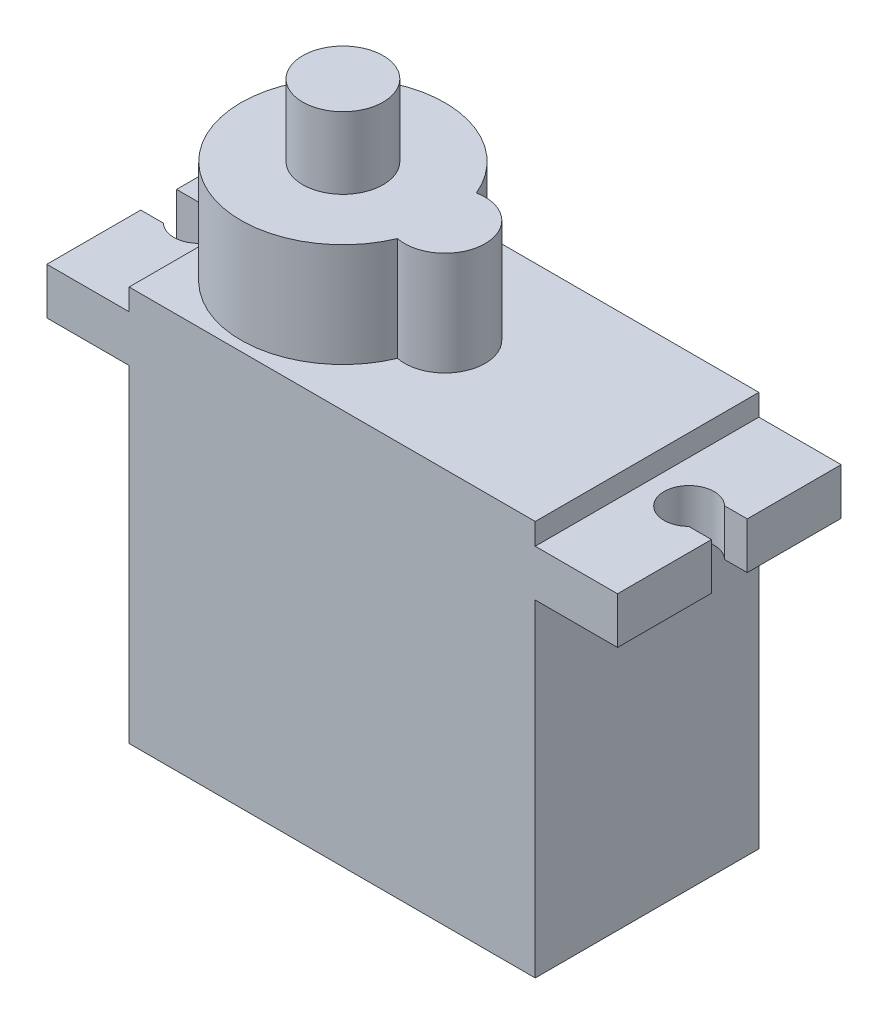
ISO-10303-21;
HEADER;
FILE_DESCRIPTION(('STEP AP214'),'2;1');
FILE_NAME('part.step','',(''),(''),'','','');
FILE_SCHEMA(('AUTOMOTIVE_DESIGN { 1 0 10303 214 1 1 1 1 }'));
ENDSEC;
DATA;
#1=APPLICATION_CONTEXT('core data for automotive mechanical design processes');
#2=APPLICATION_PROTOCOL_DEFINITION('international standard','automotive_design',2000,#1);
#3=PRODUCT_CONTEXT('',#1,'mechanical');
#4=PRODUCT('Part','Part','',(#3));
#5=PRODUCT_RELATED_PRODUCT_CATEGORY('part','',(#4));
#6=PRODUCT_DEFINITION_FORMATION('','',#4);
#7=PRODUCT_DEFINITION_CONTEXT('part definition',#1,'design');
#8=PRODUCT_DEFINITION('design','',#6,#7);
#9=PRODUCT_DEFINITION_SHAPE('','',#8);
#10=(LENGTH_UNIT() NAMED_UNIT(*) SI_UNIT(.MILLI.,.METRE.));
#11=(NAMED_UNIT(*) PLANE_ANGLE_UNIT() SI_UNIT($,.RADIAN.));
#12=(NAMED_UNIT(*) SI_UNIT($,.STERADIAN.) SOLID_ANGLE_UNIT());
#13=UNCERTAINTY_MEASURE_WITH_UNIT(LENGTH_MEASURE(1.E-05),#10,'distance_accuracy_value','');
#14=(GEOMETRIC_REPRESENTATION_CONTEXT(3) GLOBAL_UNCERTAINTY_ASSIGNED_CONTEXT((#13)) GLOBAL_UNIT_ASSIGNED_CONTEXT((#10,
#11,#12)) REPRESENTATION_CONTEXT('',''));
#15=CARTESIAN_POINT('',(0.,0.,0.));
#16=DIRECTION('',(0.,0.,1.));
#17=DIRECTION('',(1.,0.,0.));
#18=AXIS2_PLACEMENT_3D('',#15,#16,#17);
#19=CARTESIAN_POINT('',(15.95,11.75,12.5));
#20=DIRECTION('',(-1.,0.,0.));
#21=DIRECTION('',(0.,0.,1.));
#22=AXIS2_PLACEMENT_3D('',#19,#20,#21);
#23=PLANE('',#22);
#24=DIRECTION('',(0.,0.,-1.));
#25=VECTOR('',#24,1.);
#26=CARTESIAN_POINT('',(15.95,11.75,12.5));
#27=LINE('',#26,#25);
#28=CARTESIAN_POINT('',(15.95,11.75,5.25));
#29=VERTEX_POINT('',#28);
#30=CARTESIAN_POINT('',(15.95,11.75,0.));
#31=VERTEX_POINT('',#30);
#32=EDGE_CURVE('E210',#29,#31,#27,.T.);
#33=ORIENTED_EDGE('',*,*,#32,.F.);
#34=DIRECTION('',(0.,1.,0.));
#35=VECTOR('',#34,1.);
#36=CARTESIAN_POINT('',(15.95,6.25,5.25));
#37=LINE('',#36,#35);
#38=CARTESIAN_POINT('',(15.95,9.15,5.25));
#39=VERTEX_POINT('',#38);
#40=EDGE_CURVE('E204',#39,#29,#37,.T.);
#41=ORIENTED_EDGE('',*,*,#40,.F.);
#42=DIRECTION('',(0.,0.,-1.));
#43=VECTOR('',#42,1.);
#44=CARTESIAN_POINT('',(15.95,9.15,12.5));
#45=LINE('',#44,#43);
#46=CARTESIAN_POINT('',(15.95,9.15,0.));
#47=VERTEX_POINT('',#46);
#48=EDGE_CURVE('E209',#39,#47,#45,.T.);
#49=ORIENTED_EDGE('',*,*,#48,.T.);
#50=DIRECTION('',(0.,1.,0.));
#51=VECTOR('',#50,1.);
#52=CARTESIAN_POINT('',(15.95,11.75,0.));
#53=LINE('',#52,#51);
#54=EDGE_CURVE('E298',#47,#31,#53,.T.);
#55=ORIENTED_EDGE('',*,*,#54,.T.);
#56=EDGE_LOOP('',(#33,#41,#49,#55));
#57=FACE_BOUND('',#56,.T.);
#58=ADVANCED_FACE('F33',(#57),#23,.F.);
#59=CARTESIAN_POINT('',(-15.95,11.75,12.5));
#60=DIRECTION('',(1.,0.,0.));
#61=DIRECTION('',(0.,0.,-1.));
#62=AXIS2_PLACEMENT_3D('',#59,#60,#61);
#63=PLANE('',#62);
#64=DIRECTION('',(0.,0.,-1.));
#65=VECTOR('',#64,1.);
#66=CARTESIAN_POINT('',(-15.95,11.75,12.5));
#67=LINE('',#66,#65);
#68=CARTESIAN_POINT('',(-15.95,11.75,12.5));
#69=VERTEX_POINT('',#68);
#70=CARTESIAN_POINT('',(-15.95,11.75,7.25));
#71=VERTEX_POINT('',#70);
#72=EDGE_CURVE('E333',#69,#71,#67,.T.);
#73=ORIENTED_EDGE('',*,*,#72,.T.);
#74=DIRECTION('',(0.,1.,0.));
#75=VECTOR('',#74,1.);
#76=CARTESIAN_POINT('',(-15.95,6.24999999999999,7.25));
#77=LINE('',#76,#75);
#78=CARTESIAN_POINT('',(-15.95,9.15,7.25));
#79=VERTEX_POINT('',#78);
#80=EDGE_CURVE('E242',#79,#71,#77,.T.);
#81=ORIENTED_EDGE('',*,*,#80,.F.);
#82=DIRECTION('',(0.,0.,-1.));
#83=VECTOR('',#82,1.);
#84=CARTESIAN_POINT('',(-15.95,9.15,12.5));
#85=LINE('',#84,#83);
#86=CARTESIAN_POINT('',(-15.95,9.15,12.5));
#87=VERTEX_POINT('',#86);
#88=EDGE_CURVE('E330',#87,#79,#85,.T.);
#89=ORIENTED_EDGE('',*,*,#88,.F.);
#90=DIRECTION('',(0.,-1.,0.));
#91=VECTOR('',#90,1.);
#92=CARTESIAN_POINT('',(-15.95,11.75,12.5));
#93=LINE('',#92,#91);
#94=EDGE_CURVE('E284',#69,#87,#93,.T.);
#95=ORIENTED_EDGE('',*,*,#94,.F.);
#96=EDGE_LOOP('',(#73,#81,#89,#95));
#97=FACE_BOUND('',#96,.T.);
#98=ADVANCED_FACE('F388',(#97),#63,.F.);
#99=CARTESIAN_POINT('',(11.35,9.15,12.5));
#100=DIRECTION('',(-1.,0.,0.));
#101=DIRECTION('',(0.,0.,1.));
#102=AXIS2_PLACEMENT_3D('',#99,#100,#101);
#103=PLANE('',#102);
#104=DIRECTION('',(0.,1.,0.));
#105=VECTOR('',#104,1.);
#106=CARTESIAN_POINT('',(11.35,9.15,0.));
#107=LINE('',#106,#105);
#108=CARTESIAN_POINT('',(11.35,-9.15,0.));
#109=VERTEX_POINT('',#108);
#110=CARTESIAN_POINT('',(11.35,9.15,0.));
#111=VERTEX_POINT('',#110);
#112=EDGE_CURVE('E266',#109,#111,#107,.T.);
#113=ORIENTED_EDGE('',*,*,#112,.T.);
#114=DIRECTION('',(0.,0.,-1.));
#115=VECTOR('',#114,1.);
#116=CARTESIAN_POINT('',(11.35,9.15,12.5));
#117=LINE('',#116,#115);
#118=CARTESIAN_POINT('',(11.35,9.15,12.5));
#119=VERTEX_POINT('',#118);
#120=EDGE_CURVE('E217',#119,#111,#117,.T.);
#121=ORIENTED_EDGE('',*,*,#120,.F.);
#122=DIRECTION('',(0.,1.,0.));
#123=VECTOR('',#122,1.);
#124=CARTESIAN_POINT('',(11.35,9.15,12.5));
#125=LINE('',#124,#123);
#126=CARTESIAN_POINT('',(11.35,-9.15,12.5));
#127=VERTEX_POINT('',#126);
#128=EDGE_CURVE('E267',#127,#119,#125,.T.);
#129=ORIENTED_EDGE('',*,*,#128,.F.);
#130=DIRECTION('',(0.,0.,-1.));
#131=VECTOR('',#130,1.);
#132=CARTESIAN_POINT('',(11.35,-9.15,12.5));
#133=LINE('',#132,#131);
#134=EDGE_CURVE('E292',#127,#109,#133,.T.);
#135=ORIENTED_EDGE('',*,*,#134,.T.);
#136=EDGE_LOOP('',(#113,#121,#129,#135));
#137=FACE_BOUND('',#136,.T.);
#138=ADVANCED_FACE('F35',(#137),#103,.F.);
#139=CARTESIAN_POINT('',(11.35,9.15,12.5));
#140=DIRECTION('',(0.,1.,0.));
#141=DIRECTION('',(0.,0.,1.));
#142=AXIS2_PLACEMENT_3D('',#139,#140,#141);
#143=PLANE('',#142);
#144=ORIENTED_EDGE('',*,*,#48,.F.);
#145=DIRECTION('',(-1.,0.,0.));
#146=VECTOR('',#145,1.);
#147=CARTESIAN_POINT('',(11.35,9.15,5.25));
#148=LINE('',#147,#146);
#149=CARTESIAN_POINT('',(14.6797958971133,9.15,5.25));
#150=VERTEX_POINT('',#149);
#151=EDGE_CURVE('E413',#39,#150,#148,.T.);
#152=ORIENTED_EDGE('',*,*,#151,.T.);
#153=CARTESIAN_POINT('',(13.7,9.15,6.25));
#154=DIRECTION('',(0.,1.,0.));
#155=DIRECTION('',(0.,0.,1.));
#156=AXIS2_PLACEMENT_3D('',#153,#154,#155);
#157=CIRCLE('',#156,1.4);
#158=CARTESIAN_POINT('',(14.6797958971133,9.15,7.25));
#159=VERTEX_POINT('',#158);
#160=EDGE_CURVE('E427',#150,#159,#157,.T.);
#161=ORIENTED_EDGE('',*,*,#160,.T.);
#162=DIRECTION('',(1.,0.,0.));
#163=VECTOR('',#162,1.);
#164=CARTESIAN_POINT('',(11.35,9.15,7.25));
#165=LINE('',#164,#163);
#166=CARTESIAN_POINT('',(15.95,9.15,7.25));
#167=VERTEX_POINT('',#166);
#168=EDGE_CURVE('E420',#159,#167,#165,.T.);
#169=ORIENTED_EDGE('',*,*,#168,.T.);
#170=CARTESIAN_POINT('',(15.95,9.15,12.5));
#171=VERTEX_POINT('',#170);
#172=EDGE_CURVE('E203',#171,#167,#45,.T.);
#173=ORIENTED_EDGE('',*,*,#172,.F.);
#174=DIRECTION('',(1.,0.,0.));
#175=VECTOR('',#174,1.);
#176=CARTESIAN_POINT('',(11.35,9.15,12.5));
#177=LINE('',#176,#175);
#178=EDGE_CURVE('E270',#119,#171,#177,.T.);
#179=ORIENTED_EDGE('',*,*,#178,.F.);
#180=ORIENTED_EDGE('',*,*,#120,.T.);
#181=DIRECTION('',(1.,0.,0.));
#182=VECTOR('',#181,1.);
#183=CARTESIAN_POINT('',(11.35,9.15,0.));
#184=LINE('',#183,#182);
#185=EDGE_CURVE('E295',#111,#47,#184,.T.);
#186=ORIENTED_EDGE('',*,*,#185,.T.);
#187=EDGE_LOOP('',(#144,#152,#161,#169,#173,#179,#180,#186));
#188=FACE_BOUND('',#187,.T.);
#189=ADVANCED_FACE('F400',(#188),#143,.F.);
#190=ORIENTED_EDGE('',*,*,#172,.T.);
#191=DIRECTION('',(0.,1.,0.));
#192=VECTOR('',#191,1.);
#193=CARTESIAN_POINT('',(15.95,6.25,7.25));
#194=LINE('',#193,#192);
#195=CARTESIAN_POINT('',(15.95,11.75,7.25));
#196=VERTEX_POINT('',#195);
#197=EDGE_CURVE('E188',#167,#196,#194,.T.);
#198=ORIENTED_EDGE('',*,*,#197,.T.);
#199=CARTESIAN_POINT('',(15.95,11.75,12.5));
#200=VERTEX_POINT('',#199);
#201=EDGE_CURVE('E200',#200,#196,#27,.T.);
#202=ORIENTED_EDGE('',*,*,#201,.F.);
#203=DIRECTION('',(0.,1.,0.));
#204=VECTOR('',#203,1.);
#205=CARTESIAN_POINT('',(15.95,11.75,12.5));
#206=LINE('',#205,#204);
#207=EDGE_CURVE('E273',#171,#200,#206,.T.);
#208=ORIENTED_EDGE('',*,*,#207,.F.);
#209=EDGE_LOOP('',(#190,#198,#202,#208));
#210=FACE_BOUND('',#209,.T.);
#211=ADVANCED_FACE('F198',(#210),#23,.F.);
#212=CARTESIAN_POINT('',(11.35,11.75,12.5));
#213=DIRECTION('',(0.,-1.,0.));
#214=DIRECTION('',(1.,0.,0.));
#215=AXIS2_PLACEMENT_3D('',#212,#213,#214);
#216=PLANE('',#215);
#217=CARTESIAN_POINT('',(13.7,11.75,6.25));
#218=DIRECTION('',(0.,1.,0.));
#219=DIRECTION('',(1.,0.,0.));
#220=AXIS2_PLACEMENT_3D('',#217,#218,#219);
#221=CIRCLE('',#220,1.4);
#222=CARTESIAN_POINT('',(14.6797958971133,11.75,5.25));
#223=VERTEX_POINT('',#222);
#224=CARTESIAN_POINT('',(14.6797958971133,11.75,7.25));
#225=VERTEX_POINT('',#224);
#226=EDGE_CURVE('E48',#223,#225,#221,.T.);
#227=ORIENTED_EDGE('',*,*,#226,.F.);
#228=DIRECTION('',(-1.,0.,0.));
#229=VECTOR('',#228,1.);
#230=CARTESIAN_POINT('',(15.95,11.75,5.25));
#231=LINE('',#230,#229);
#232=EDGE_CURVE('E193',#29,#223,#231,.T.);
#233=ORIENTED_EDGE('',*,*,#232,.F.);
#234=ORIENTED_EDGE('',*,*,#32,.T.);
#235=DIRECTION('',(-1.,0.,0.));
#236=VECTOR('',#235,1.);
#237=CARTESIAN_POINT('',(11.35,11.75,0.));
#238=LINE('',#237,#236);
#239=CARTESIAN_POINT('',(11.35,11.75,0.));
#240=VERTEX_POINT('',#239);
#241=EDGE_CURVE('E301',#31,#240,#238,.T.);
#242=ORIENTED_EDGE('',*,*,#241,.T.);
#243=DIRECTION('',(0.,0.,-1.));
#244=VECTOR('',#243,1.);
#245=CARTESIAN_POINT('',(11.35,11.75,12.5));
#246=LINE('',#245,#244);
#247=CARTESIAN_POINT('',(11.35,11.75,12.5));
#248=VERTEX_POINT('',#247);
#249=EDGE_CURVE('E213',#248,#240,#246,.T.);
#250=ORIENTED_EDGE('',*,*,#249,.F.);
#251=DIRECTION('',(-1.,0.,0.));
#252=VECTOR('',#251,1.);
#253=CARTESIAN_POINT('',(11.35,11.75,12.5));
#254=LINE('',#253,#252);
#255=EDGE_CURVE('E208',#200,#248,#254,.T.);
#256=ORIENTED_EDGE('',*,*,#255,.F.);
#257=ORIENTED_EDGE('',*,*,#201,.T.);
#258=DIRECTION('',(1.,0.,0.));
#259=VECTOR('',#258,1.);
#260=CARTESIAN_POINT('',(15.95,11.75,7.25));
#261=LINE('',#260,#259);
#262=EDGE_CURVE('E185',#225,#196,#261,.T.);
#263=ORIENTED_EDGE('',*,*,#262,.F.);
#264=EDGE_LOOP('',(#227,#233,#234,#242,#250,#256,#257,#263));
#265=FACE_BOUND('',#264,.T.);
#266=ADVANCED_FACE('F206',(#265),#216,.F.);
#267=CARTESIAN_POINT('',(11.35,12.95,12.5));
#268=DIRECTION('',(-1.,0.,0.));
#269=DIRECTION('',(0.,0.,1.));
#270=AXIS2_PLACEMENT_3D('',#267,#268,#269);
#271=PLANE('',#270);
#272=DIRECTION('',(0.,1.,0.));
#273=VECTOR('',#272,1.);
#274=CARTESIAN_POINT('',(11.35,12.95,0.));
#275=LINE('',#274,#273);
#276=CARTESIAN_POINT('',(11.35,12.95,0.));
#277=VERTEX_POINT('',#276);
#278=EDGE_CURVE('E303',#240,#277,#275,.T.);
#279=ORIENTED_EDGE('',*,*,#278,.T.);
#280=DIRECTION('',(0.,0.,-1.));
#281=VECTOR('',#280,1.);
#282=CARTESIAN_POINT('',(11.35,12.95,12.5));
#283=LINE('',#282,#281);
#284=CARTESIAN_POINT('',(11.35,12.95,12.5));
#285=VERTEX_POINT('',#284);
#286=EDGE_CURVE('E342',#285,#277,#283,.T.);
#287=ORIENTED_EDGE('',*,*,#286,.F.);
#288=DIRECTION('',(0.,1.,0.));
#289=VECTOR('',#288,1.);
#290=CARTESIAN_POINT('',(11.35,12.95,12.5));
#291=LINE('',#290,#289);
#292=EDGE_CURVE('E276',#248,#285,#291,.T.);
#293=ORIENTED_EDGE('',*,*,#292,.F.);
#294=ORIENTED_EDGE('',*,*,#249,.T.);
#295=EDGE_LOOP('',(#279,#287,#293,#294));
#296=FACE_BOUND('',#295,.T.);
#297=ADVANCED_FACE('F352',(#296),#271,.F.);
#298=CARTESIAN_POINT('',(-11.35,12.95,12.5));
#299=DIRECTION('',(0.,-1.,0.));
#300=DIRECTION('',(0.,0.,-1.));
#301=AXIS2_PLACEMENT_3D('',#298,#299,#300);
#302=PLANE('',#301);
#303=CARTESIAN_POINT('',(0.0499999999999962,12.95,6.25));
#304=DIRECTION('',(0.,1.,0.));
#305=DIRECTION('',(0.,0.,1.));
#306=AXIS2_PLACEMENT_3D('',#303,#304,#305);
#307=CIRCLE('',#306,2.25);
#308=CARTESIAN_POINT('',(-0.394078947368422,12.95,8.45574112001026));
#309=VERTEX_POINT('',#308);
#310=CARTESIAN_POINT('',(-0.394078947368426,12.95,4.04425887998973));
#311=VERTEX_POINT('',#310);
#312=EDGE_CURVE('E241',#309,#311,#307,.T.);
#313=ORIENTED_EDGE('',*,*,#312,.F.);
#314=CARTESIAN_POINT('',(-5.65,12.95,6.25));
#315=DIRECTION('',(0.,1.,0.));
#316=DIRECTION('',(0.,0.,1.));
#317=AXIS2_PLACEMENT_3D('',#314,#315,#316);
#318=CIRCLE('',#317,5.7);
#319=CARTESIAN_POINT('',(-11.35,12.95,6.25));
#320=VERTEX_POINT('',#319);
#321=EDGE_CURVE('E220',#320,#309,#318,.T.);
#322=ORIENTED_EDGE('',*,*,#321,.F.);
#323=DIRECTION('',(0.,0.,-1.));
#324=VECTOR('',#323,1.);
#325=CARTESIAN_POINT('',(-11.35,12.95,12.5));
#326=LINE('',#325,#324);
#327=CARTESIAN_POINT('',(-11.35,12.95,12.5));
#328=VERTEX_POINT('',#327);
#329=EDGE_CURVE('E340',#328,#320,#326,.T.);
#330=ORIENTED_EDGE('',*,*,#329,.F.);
#331=DIRECTION('',(-1.,0.,0.));
#332=VECTOR('',#331,1.);
#333=CARTESIAN_POINT('',(-11.35,12.95,12.5));
#334=LINE('',#333,#332);
#335=EDGE_CURVE('E278',#285,#328,#334,.T.);
#336=ORIENTED_EDGE('',*,*,#335,.F.);
#337=ORIENTED_EDGE('',*,*,#286,.T.);
#338=DIRECTION('',(-1.,0.,0.));
#339=VECTOR('',#338,1.);
#340=CARTESIAN_POINT('',(-11.35,12.95,0.));
#341=LINE('',#340,#339);
#342=CARTESIAN_POINT('',(-11.35,12.95,0.));
#343=VERTEX_POINT('',#342);
#344=EDGE_CURVE('E305',#277,#343,#341,.T.);
#345=ORIENTED_EDGE('',*,*,#344,.T.);
#346=EDGE_CURVE('E339',#320,#343,#326,.T.);
#347=ORIENTED_EDGE('',*,*,#346,.F.);
#348=EDGE_CURVE('E245',#311,#320,#318,.T.);
#349=ORIENTED_EDGE('',*,*,#348,.F.);
#350=EDGE_LOOP('',(#313,#322,#330,#336,#337,#345,#347,#349));
#351=FACE_BOUND('',#350,.T.);
#352=ADVANCED_FACE('F361',(#351),#302,.F.);
#353=CARTESIAN_POINT('',(-11.35,12.95,12.5));
#354=DIRECTION('',(1.,0.,0.));
#355=DIRECTION('',(0.,0.,-1.));
#356=AXIS2_PLACEMENT_3D('',#353,#354,#355);
#357=PLANE('',#356);
#358=DIRECTION('',(0.,-1.,0.));
#359=VECTOR('',#358,1.);
#360=CARTESIAN_POINT('',(-11.35,12.95,0.));
#361=LINE('',#360,#359);
#362=CARTESIAN_POINT('',(-11.35,11.75,0.));
#363=VERTEX_POINT('',#362);
#364=EDGE_CURVE('E308',#343,#363,#361,.T.);
#365=ORIENTED_EDGE('',*,*,#364,.T.);
#366=DIRECTION('',(0.,0.,-1.));
#367=VECTOR('',#366,1.);
#368=CARTESIAN_POINT('',(-11.35,11.75,12.5));
#369=LINE('',#368,#367);
#370=CARTESIAN_POINT('',(-11.35,11.75,12.5));
#371=VERTEX_POINT('',#370);
#372=EDGE_CURVE('E336',#371,#363,#369,.T.);
#373=ORIENTED_EDGE('',*,*,#372,.F.);
#374=DIRECTION('',(0.,-1.,0.));
#375=VECTOR('',#374,1.);
#376=CARTESIAN_POINT('',(-11.35,12.95,12.5));
#377=LINE('',#376,#375);
#378=EDGE_CURVE('E280',#328,#371,#377,.T.);
#379=ORIENTED_EDGE('',*,*,#378,.F.);
#380=ORIENTED_EDGE('',*,*,#329,.T.);
#381=ORIENTED_EDGE('',*,*,#346,.T.);
#382=EDGE_LOOP('',(#365,#373,#379,#380,#381));
#383=FACE_BOUND('',#382,.T.);
#384=ADVANCED_FACE('F365',(#383),#357,.F.);
#385=CARTESIAN_POINT('',(-15.95,11.75,12.5));
#386=DIRECTION('',(0.,-1.,0.));
#387=DIRECTION('',(1.,0.,0.));
#388=AXIS2_PLACEMENT_3D('',#385,#386,#387);
#389=PLANE('',#388);
#390=CARTESIAN_POINT('',(-13.7,11.75,6.25));
#391=DIRECTION('',(0.,1.,0.));
#392=DIRECTION('',(-1.,0.,0.));
#393=AXIS2_PLACEMENT_3D('',#390,#391,#392);
#394=CIRCLE('',#393,1.4);
#395=CARTESIAN_POINT('',(-14.6797958971133,11.75,7.25));
#396=VERTEX_POINT('',#395);
#397=CARTESIAN_POINT('',(-14.6797958971133,11.75,5.25));
#398=VERTEX_POINT('',#397);
#399=EDGE_CURVE('E429',#396,#398,#394,.T.);
#400=ORIENTED_EDGE('',*,*,#399,.F.);
#401=DIRECTION('',(1.,0.,0.));
#402=VECTOR('',#401,1.);
#403=CARTESIAN_POINT('',(-15.95,11.75,7.25));
#404=LINE('',#403,#402);
#405=EDGE_CURVE('E239',#71,#396,#404,.T.);
#406=ORIENTED_EDGE('',*,*,#405,.F.);
#407=ORIENTED_EDGE('',*,*,#72,.F.);
#408=DIRECTION('',(-1.,0.,0.));
#409=VECTOR('',#408,1.);
#410=CARTESIAN_POINT('',(-15.95,11.75,12.5));
#411=LINE('',#410,#409);
#412=EDGE_CURVE('E282',#371,#69,#411,.T.);
#413=ORIENTED_EDGE('',*,*,#412,.F.);
#414=ORIENTED_EDGE('',*,*,#372,.T.);
#415=DIRECTION('',(-1.,0.,0.));
#416=VECTOR('',#415,1.);
#417=CARTESIAN_POINT('',(-15.95,11.75,0.));
#418=LINE('',#417,#416);
#419=CARTESIAN_POINT('',(-15.95,11.75,0.));
#420=VERTEX_POINT('',#419);
#421=EDGE_CURVE('E310',#363,#420,#418,.T.);
#422=ORIENTED_EDGE('',*,*,#421,.T.);
#423=CARTESIAN_POINT('',(-15.95,11.75,5.25));
#424=VERTEX_POINT('',#423);
#425=EDGE_CURVE('E332',#424,#420,#67,.T.);
#426=ORIENTED_EDGE('',*,*,#425,.F.);
#427=DIRECTION('',(-1.,0.,0.));
#428=VECTOR('',#427,1.);
#429=CARTESIAN_POINT('',(-15.95,11.75,5.25));
#430=LINE('',#429,#428);
#431=EDGE_CURVE('E430',#398,#424,#430,.T.);
#432=ORIENTED_EDGE('',*,*,#431,.F.);
#433=EDGE_LOOP('',(#400,#406,#407,#413,#414,#422,#426,#432));
#434=FACE_BOUND('',#433,.T.);
#435=ADVANCED_FACE('F436',(#434),#389,.F.);
#436=CARTESIAN_POINT('',(-15.95,9.15,5.25));
#437=VERTEX_POINT('',#436);
#438=CARTESIAN_POINT('',(-15.95,9.15,0.));
#439=VERTEX_POINT('',#438);
#440=EDGE_CURVE('E329',#437,#439,#85,.T.);
#441=ORIENTED_EDGE('',*,*,#440,.F.);
#442=DIRECTION('',(0.,1.,0.));
#443=VECTOR('',#442,1.);
#444=CARTESIAN_POINT('',(-15.95,6.24999999999999,5.25));
#445=LINE('',#444,#443);
#446=EDGE_CURVE('E56',#437,#424,#445,.T.);
#447=ORIENTED_EDGE('',*,*,#446,.T.);
#448=ORIENTED_EDGE('',*,*,#425,.T.);
#449=DIRECTION('',(0.,-1.,0.));
#450=VECTOR('',#449,1.);
#451=CARTESIAN_POINT('',(-15.95,11.75,0.));
#452=LINE('',#451,#450);
#453=EDGE_CURVE('E313',#420,#439,#452,.T.);
#454=ORIENTED_EDGE('',*,*,#453,.T.);
#455=EDGE_LOOP('',(#441,#447,#448,#454));
#456=FACE_BOUND('',#455,.T.);
#457=ADVANCED_FACE('F396',(#456),#63,.F.);
#458=CARTESIAN_POINT('',(-15.95,9.15,12.5));
#459=DIRECTION('',(0.,1.,0.));
#460=DIRECTION('',(0.,0.,1.));
#461=AXIS2_PLACEMENT_3D('',#458,#459,#460);
#462=PLANE('',#461);
#463=ORIENTED_EDGE('',*,*,#88,.T.);
#464=DIRECTION('',(1.,0.,0.));
#465=VECTOR('',#464,1.);
#466=CARTESIAN_POINT('',(-15.95,9.15,7.25));
#467=LINE('',#466,#465);
#468=CARTESIAN_POINT('',(-14.6797958971133,9.15,7.25));
#469=VERTEX_POINT('',#468);
#470=EDGE_CURVE('E11',#79,#469,#467,.T.);
#471=ORIENTED_EDGE('',*,*,#470,.T.);
#472=CARTESIAN_POINT('',(-13.7,9.15,6.25));
#473=DIRECTION('',(0.,1.,0.));
#474=DIRECTION('',(0.,0.,1.));
#475=AXIS2_PLACEMENT_3D('',#472,#473,#474);
#476=CIRCLE('',#475,1.4);
#477=CARTESIAN_POINT('',(-14.6797958971133,9.15,5.25));
#478=VERTEX_POINT('',#477);
#479=EDGE_CURVE('E41',#469,#478,#476,.T.);
#480=ORIENTED_EDGE('',*,*,#479,.T.);
#481=DIRECTION('',(-1.,0.,0.));
#482=VECTOR('',#481,1.);
#483=CARTESIAN_POINT('',(-15.95,9.15,5.25));
#484=LINE('',#483,#482);
#485=EDGE_CURVE('E221',#478,#437,#484,.T.);
#486=ORIENTED_EDGE('',*,*,#485,.T.);
#487=ORIENTED_EDGE('',*,*,#440,.T.);
#488=DIRECTION('',(1.,0.,0.));
#489=VECTOR('',#488,1.);
#490=CARTESIAN_POINT('',(-15.95,9.15,0.));
#491=LINE('',#490,#489);
#492=CARTESIAN_POINT('',(-11.35,9.15,0.));
#493=VERTEX_POINT('',#492);
#494=EDGE_CURVE('E316',#439,#493,#491,.T.);
#495=ORIENTED_EDGE('',*,*,#494,.T.);
#496=DIRECTION('',(0.,0.,-1.));
#497=VECTOR('',#496,1.);
#498=CARTESIAN_POINT('',(-11.35,9.15,12.5));
#499=LINE('',#498,#497);
#500=CARTESIAN_POINT('',(-11.35,9.15,12.5));
#501=VERTEX_POINT('',#500);
#502=EDGE_CURVE('E326',#501,#493,#499,.T.);
#503=ORIENTED_EDGE('',*,*,#502,.F.);
#504=DIRECTION('',(1.,0.,0.));
#505=VECTOR('',#504,1.);
#506=CARTESIAN_POINT('',(-15.95,9.15,12.5));
#507=LINE('',#506,#505);
#508=EDGE_CURVE('E286',#87,#501,#507,.T.);
#509=ORIENTED_EDGE('',*,*,#508,.F.);
#510=EDGE_LOOP('',(#463,#471,#480,#486,#487,#495,#503,#509));
#511=FACE_BOUND('',#510,.T.);
#512=ADVANCED_FACE('F225',(#511),#462,.F.);
#513=CARTESIAN_POINT('',(-11.35,9.15,12.5));
#514=DIRECTION('',(1.,0.,0.));
#515=DIRECTION('',(0.,1.,0.));
#516=AXIS2_PLACEMENT_3D('',#513,#514,#515);
#517=PLANE('',#516);
#518=DIRECTION('',(0.,-1.,0.));
#519=VECTOR('',#518,1.);
#520=CARTESIAN_POINT('',(-11.35,9.15,0.));
#521=LINE('',#520,#519);
#522=CARTESIAN_POINT('',(-11.35,-9.15,0.));
#523=VERTEX_POINT('',#522);
#524=EDGE_CURVE('E318',#493,#523,#521,.T.);
#525=ORIENTED_EDGE('',*,*,#524,.T.);
#526=DIRECTION('',(0.,0.,-1.));
#527=VECTOR('',#526,1.);
#528=CARTESIAN_POINT('',(-11.35,-9.15,12.5));
#529=LINE('',#528,#527);
#530=CARTESIAN_POINT('',(-11.35,-9.15,12.5));
#531=VERTEX_POINT('',#530);
#532=EDGE_CURVE('E323',#531,#523,#529,.T.);
#533=ORIENTED_EDGE('',*,*,#532,.F.);
#534=DIRECTION('',(0.,-1.,0.));
#535=VECTOR('',#534,1.);
#536=CARTESIAN_POINT('',(-11.35,9.15,12.5));
#537=LINE('',#536,#535);
#538=EDGE_CURVE('E288',#501,#531,#537,.T.);
#539=ORIENTED_EDGE('',*,*,#538,.F.);
#540=ORIENTED_EDGE('',*,*,#502,.T.);
#541=EDGE_LOOP('',(#525,#533,#539,#540));
#542=FACE_BOUND('',#541,.T.);
#543=ADVANCED_FACE('F446',(#542),#517,.F.);
#544=CARTESIAN_POINT('',(-11.35,-9.15,12.5));
#545=DIRECTION('',(0.,1.,0.));
#546=DIRECTION('',(0.,0.,1.));
#547=AXIS2_PLACEMENT_3D('',#544,#545,#546);
#548=PLANE('',#547);
#549=DIRECTION('',(1.,0.,0.));
#550=VECTOR('',#549,1.);
#551=CARTESIAN_POINT('',(-11.35,-9.15,0.));
#552=LINE('',#551,#550);
#553=EDGE_CURVE('E271',#523,#109,#552,.T.);
#554=ORIENTED_EDGE('',*,*,#553,.T.);
#555=ORIENTED_EDGE('',*,*,#134,.F.);
#556=DIRECTION('',(1.,0.,0.));
#557=VECTOR('',#556,1.);
#558=CARTESIAN_POINT('',(-11.35,-9.15,12.5));
#559=LINE('',#558,#557);
#560=EDGE_CURVE('E290',#531,#127,#559,.T.);
#561=ORIENTED_EDGE('',*,*,#560,.F.);
#562=ORIENTED_EDGE('',*,*,#532,.T.);
#563=EDGE_LOOP('',(#554,#555,#561,#562));
#564=FACE_BOUND('',#563,.T.);
#565=ADVANCED_FACE('F613',(#564),#548,.F.);
#566=CARTESIAN_POINT('',(0.,0.,12.5));
#567=DIRECTION('',(0.,0.,1.));
#568=DIRECTION('',(1.,0.,0.));
#569=AXIS2_PLACEMENT_3D('',#566,#567,#568);
#570=PLANE('',#569);
#571=ORIENTED_EDGE('',*,*,#128,.T.);
#572=ORIENTED_EDGE('',*,*,#178,.T.);
#573=ORIENTED_EDGE('',*,*,#207,.T.);
#574=ORIENTED_EDGE('',*,*,#255,.T.);
#575=ORIENTED_EDGE('',*,*,#292,.T.);
#576=ORIENTED_EDGE('',*,*,#335,.T.);
#577=ORIENTED_EDGE('',*,*,#378,.T.);
#578=ORIENTED_EDGE('',*,*,#412,.T.);
#579=ORIENTED_EDGE('',*,*,#94,.T.);
#580=ORIENTED_EDGE('',*,*,#508,.T.);
#581=ORIENTED_EDGE('',*,*,#538,.T.);
#582=ORIENTED_EDGE('',*,*,#560,.T.);
#583=EDGE_LOOP('',(#571,#572,#573,#574,#575,#576,#577,#578,#579,#580,#581,#582));
#584=FACE_BOUND('',#583,.T.);
#585=ADVANCED_FACE('F450',(#584),#570,.T.);
#586=CARTESIAN_POINT('',(0.,0.,0.));
#587=DIRECTION('',(0.,0.,1.));
#588=DIRECTION('',(1.,0.,0.));
#589=AXIS2_PLACEMENT_3D('',#586,#587,#588);
#590=PLANE('',#589);
#591=ORIENTED_EDGE('',*,*,#112,.F.);
#592=ORIENTED_EDGE('',*,*,#553,.F.);
#593=ORIENTED_EDGE('',*,*,#524,.F.);
#594=ORIENTED_EDGE('',*,*,#494,.F.);
#595=ORIENTED_EDGE('',*,*,#453,.F.);
#596=ORIENTED_EDGE('',*,*,#421,.F.);
#597=ORIENTED_EDGE('',*,*,#364,.F.);
#598=ORIENTED_EDGE('',*,*,#344,.F.);
#599=ORIENTED_EDGE('',*,*,#278,.F.);
#600=ORIENTED_EDGE('',*,*,#241,.F.);
#601=ORIENTED_EDGE('',*,*,#54,.F.);
#602=ORIENTED_EDGE('',*,*,#185,.F.);
#603=EDGE_LOOP('',(#591,#592,#593,#594,#595,#596,#597,#598,#599,#600,#601,#602));
#604=FACE_BOUND('',#603,.T.);
#605=ADVANCED_FACE('F356',(#604),#590,.F.);
#606=CARTESIAN_POINT('',(0.0499999999999962,18.75,6.25));
#607=DIRECTION('',(0.,-1.,0.));
#608=DIRECTION('',(0.,0.,-1.));
#609=AXIS2_PLACEMENT_3D('',#606,#607,#608);
#610=CYLINDRICAL_SURFACE('',#609,2.25);
#611=ORIENTED_EDGE('',*,*,#312,.T.);
#612=DIRECTION('',(0.,-1.,0.));
#613=VECTOR('',#612,1.);
#614=CARTESIAN_POINT('',(-0.394078947368426,18.75,4.04425887998973));
#615=LINE('',#614,#613);
#616=CARTESIAN_POINT('',(-0.394078947368426,18.75,4.04425887998973));
#617=VERTEX_POINT('',#616);
#618=EDGE_CURVE('E263',#617,#311,#615,.T.);
#619=ORIENTED_EDGE('',*,*,#618,.F.);
#620=CARTESIAN_POINT('',(0.0499999999999962,18.75,6.25));
#621=DIRECTION('',(0.,1.,0.));
#622=DIRECTION('',(0.,0.,1.));
#623=AXIS2_PLACEMENT_3D('',#620,#621,#622);
#624=CIRCLE('',#623,2.25);
#625=CARTESIAN_POINT('',(-0.394078947368422,18.75,8.45574112001026));
#626=VERTEX_POINT('',#625);
#627=EDGE_CURVE('E253',#626,#617,#624,.T.);
#628=ORIENTED_EDGE('',*,*,#627,.F.);
#629=DIRECTION('',(0.,-1.,0.));
#630=VECTOR('',#629,1.);
#631=CARTESIAN_POINT('',(-0.394078947368422,18.75,8.45574112001026));
#632=LINE('',#631,#630);
#633=EDGE_CURVE('E257',#626,#309,#632,.T.);
#634=ORIENTED_EDGE('',*,*,#633,.T.);
#635=EDGE_LOOP('',(#611,#619,#628,#634));
#636=FACE_BOUND('',#635,.T.);
#637=ADVANCED_FACE('F374',(#636),#610,.T.);
#638=CARTESIAN_POINT('',(-5.65,18.75,6.25));
#639=DIRECTION('',(0.,-1.,0.));
#640=DIRECTION('',(0.,0.,-1.));
#641=AXIS2_PLACEMENT_3D('',#638,#639,#640);
#642=CYLINDRICAL_SURFACE('',#641,5.7);
#643=ORIENTED_EDGE('',*,*,#348,.T.);
#644=ORIENTED_EDGE('',*,*,#321,.T.);
#645=ORIENTED_EDGE('',*,*,#633,.F.);
#646=CARTESIAN_POINT('',(-5.65,18.75,6.25));
#647=DIRECTION('',(0.,1.,0.));
#648=DIRECTION('',(0.,0.,1.));
#649=AXIS2_PLACEMENT_3D('',#646,#647,#648);
#650=CIRCLE('',#649,5.7);
#651=EDGE_CURVE('E256',#617,#626,#650,.T.);
#652=ORIENTED_EDGE('',*,*,#651,.F.);
#653=ORIENTED_EDGE('',*,*,#618,.T.);
#654=EDGE_LOOP('',(#643,#644,#645,#652,#653));
#655=FACE_BOUND('',#654,.T.);
#656=ADVANCED_FACE('F369',(#655),#642,.T.);
#657=CARTESIAN_POINT('',(-2.8,18.75,6.25));
#658=DIRECTION('',(0.,1.,0.));
#659=DIRECTION('',(0.,0.,1.));
#660=AXIS2_PLACEMENT_3D('',#657,#658,#659);
#661=PLANE('',#660);
#662=CARTESIAN_POINT('',(-5.65,18.75,6.25));
#663=DIRECTION('',(0.,1.,0.));
#664=DIRECTION('',(0.,0.,1.));
#665=AXIS2_PLACEMENT_3D('',#662,#663,#664);
#666=CIRCLE('',#665,2.25);
#667=CARTESIAN_POINT('',(-5.65,18.75,8.5));
#668=VERTEX_POINT('',#667);
#669=EDGE_CURVE('E463',#668,#668,#666,.T.);
#670=ORIENTED_EDGE('',*,*,#669,.F.);
#671=EDGE_LOOP('',(#670));
#672=FACE_BOUND('',#671,.T.);
#673=ORIENTED_EDGE('',*,*,#627,.T.);
#674=ORIENTED_EDGE('',*,*,#651,.T.);
#675=EDGE_LOOP('',(#673,#674));
#676=FACE_BOUND('',#675,.T.);
#677=ADVANCED_FACE('F376',(#672,#676),#661,.T.);
#678=CARTESIAN_POINT('',(-13.7,6.24999999999999,6.25));
#679=DIRECTION('',(0.,1.,0.));
#680=DIRECTION('',(-1.,0.,0.));
#681=AXIS2_PLACEMENT_3D('',#678,#679,#680);
#682=CYLINDRICAL_SURFACE('',#681,1.4);
#683=DIRECTION('',(0.,1.,0.));
#684=VECTOR('',#683,1.);
#685=CARTESIAN_POINT('',(-14.6797958971133,6.24999999999999,7.25));
#686=LINE('',#685,#684);
#687=EDGE_CURVE('E232',#469,#396,#686,.T.);
#688=ORIENTED_EDGE('',*,*,#687,.T.);
#689=ORIENTED_EDGE('',*,*,#399,.T.);
#690=DIRECTION('',(0.,1.,0.));
#691=VECTOR('',#690,1.);
#692=CARTESIAN_POINT('',(-14.6797958971133,6.24999999999999,5.25));
#693=LINE('',#692,#691);
#694=EDGE_CURVE('E234',#478,#398,#693,.T.);
#695=ORIENTED_EDGE('',*,*,#694,.F.);
#696=ORIENTED_EDGE('',*,*,#479,.F.);
#697=EDGE_LOOP('',(#688,#689,#695,#696));
#698=FACE_BOUND('',#697,.T.);
#699=ADVANCED_FACE('F230',(#698),#682,.F.);
#700=CARTESIAN_POINT('',(-15.95,6.24999999999999,7.25));
#701=DIRECTION('',(0.,0.,1.));
#702=DIRECTION('',(1.,0.,0.));
#703=AXIS2_PLACEMENT_3D('',#700,#701,#702);
#704=PLANE('',#703);
#705=ORIENTED_EDGE('',*,*,#80,.T.);
#706=ORIENTED_EDGE('',*,*,#405,.T.);
#707=ORIENTED_EDGE('',*,*,#687,.F.);
#708=ORIENTED_EDGE('',*,*,#470,.F.);
#709=EDGE_LOOP('',(#705,#706,#707,#708));
#710=FACE_BOUND('',#709,.T.);
#711=ADVANCED_FACE('F236',(#710),#704,.F.);
#712=CARTESIAN_POINT('',(-15.95,6.24999999999999,5.25));
#713=DIRECTION('',(0.,0.,-1.));
#714=DIRECTION('',(-1.,0.,0.));
#715=AXIS2_PLACEMENT_3D('',#712,#713,#714);
#716=PLANE('',#715);
#717=ORIENTED_EDGE('',*,*,#694,.T.);
#718=ORIENTED_EDGE('',*,*,#431,.T.);
#719=ORIENTED_EDGE('',*,*,#446,.F.);
#720=ORIENTED_EDGE('',*,*,#485,.F.);
#721=EDGE_LOOP('',(#717,#718,#719,#720));
#722=FACE_BOUND('',#721,.T.);
#723=ADVANCED_FACE('F432',(#722),#716,.F.);
#724=CARTESIAN_POINT('',(13.7,6.25,6.25));
#725=DIRECTION('',(0.,1.,0.));
#726=DIRECTION('',(-1.,0.,0.));
#727=AXIS2_PLACEMENT_3D('',#724,#725,#726);
#728=CYLINDRICAL_SURFACE('',#727,1.4);
#729=DIRECTION('',(0.,1.,0.));
#730=VECTOR('',#729,1.);
#731=CARTESIAN_POINT('',(14.6797958971133,6.25,5.25));
#732=LINE('',#731,#730);
#733=EDGE_CURVE('E418',#150,#223,#732,.T.);
#734=ORIENTED_EDGE('',*,*,#733,.T.);
#735=ORIENTED_EDGE('',*,*,#226,.T.);
#736=DIRECTION('',(0.,1.,0.));
#737=VECTOR('',#736,1.);
#738=CARTESIAN_POINT('',(14.6797958971133,6.25,7.25));
#739=LINE('',#738,#737);
#740=EDGE_CURVE('E190',#159,#225,#739,.T.);
#741=ORIENTED_EDGE('',*,*,#740,.F.);
#742=ORIENTED_EDGE('',*,*,#160,.F.);
#743=EDGE_LOOP('',(#734,#735,#741,#742));
#744=FACE_BOUND('',#743,.T.);
#745=ADVANCED_FACE('F457',(#744),#728,.F.);
#746=CARTESIAN_POINT('',(15.95,6.25,5.25));
#747=DIRECTION('',(0.,0.,-1.));
#748=DIRECTION('',(-1.,0.,0.));
#749=AXIS2_PLACEMENT_3D('',#746,#747,#748);
#750=PLANE('',#749);
#751=ORIENTED_EDGE('',*,*,#40,.T.);
#752=ORIENTED_EDGE('',*,*,#232,.T.);
#753=ORIENTED_EDGE('',*,*,#733,.F.);
#754=ORIENTED_EDGE('',*,*,#151,.F.);
#755=EDGE_LOOP('',(#751,#752,#753,#754));
#756=FACE_BOUND('',#755,.T.);
#757=ADVANCED_FACE('F459',(#756),#750,.F.);
#758=CARTESIAN_POINT('',(15.95,6.25,7.25));
#759=DIRECTION('',(0.,0.,1.));
#760=DIRECTION('',(1.,0.,0.));
#761=AXIS2_PLACEMENT_3D('',#758,#759,#760);
#762=PLANE('',#761);
#763=ORIENTED_EDGE('',*,*,#740,.T.);
#764=ORIENTED_EDGE('',*,*,#262,.T.);
#765=ORIENTED_EDGE('',*,*,#197,.F.);
#766=ORIENTED_EDGE('',*,*,#168,.F.);
#767=EDGE_LOOP('',(#763,#764,#765,#766));
#768=FACE_BOUND('',#767,.T.);
#769=ADVANCED_FACE('F187',(#768),#762,.F.);
#770=CARTESIAN_POINT('',(-5.65,22.75,6.25));
#771=DIRECTION('',(0.,-1.,0.));
#772=DIRECTION('',(0.,0.,-1.));
#773=AXIS2_PLACEMENT_3D('',#770,#771,#772);
#774=CYLINDRICAL_SURFACE('',#773,2.25);
#775=CARTESIAN_POINT('',(-5.65,22.75,6.25));
#776=DIRECTION('',(0.,1.,0.));
#777=DIRECTION('',(0.,0.,1.));
#778=AXIS2_PLACEMENT_3D('',#775,#776,#777);
#779=CIRCLE('',#778,2.25);
#780=CARTESIAN_POINT('',(-5.65,22.75,8.5));
#781=VERTEX_POINT('',#780);
#782=EDGE_CURVE('E460',#781,#781,#779,.T.);
#783=ORIENTED_EDGE('',*,*,#782,.F.);
#784=EDGE_LOOP('',(#783));
#785=FACE_BOUND('',#784,.T.);
#786=ORIENTED_EDGE('',*,*,#669,.T.);
#787=EDGE_LOOP('',(#786));
#788=FACE_BOUND('',#787,.T.);
#789=ADVANCED_FACE('F468',(#785,#788),#774,.T.);
#790=CARTESIAN_POINT('',(-5.65,22.75,6.25));
#791=DIRECTION('',(0.,1.,0.));
#792=DIRECTION('',(0.,0.,1.));
#793=AXIS2_PLACEMENT_3D('',#790,#791,#792);
#794=PLANE('',#793);
#795=ORIENTED_EDGE('',*,*,#782,.T.);
#796=EDGE_LOOP('',(#795));
#797=FACE_BOUND('',#796,.T.);
#798=ADVANCED_FACE('F470',(#797),#794,.T.);
#799=CLOSED_SHELL('',(#58,#98,#138,#189,#211,#266,#297,#352,#384,#435,#457,#512,#543,#565,#585,
#605,#637,#656,#677,#699,#711,#723,#745,#757,#769,#789,#798));
#800=MANIFOLD_SOLID_BREP('B2',#799);
#801=ADVANCED_BREP_SHAPE_REPRESENTATION('',(#18,#800),#14);
#802=SHAPE_DEFINITION_REPRESENTATION(#9,#801);
ENDSEC;
END-ISO-10303-21;
